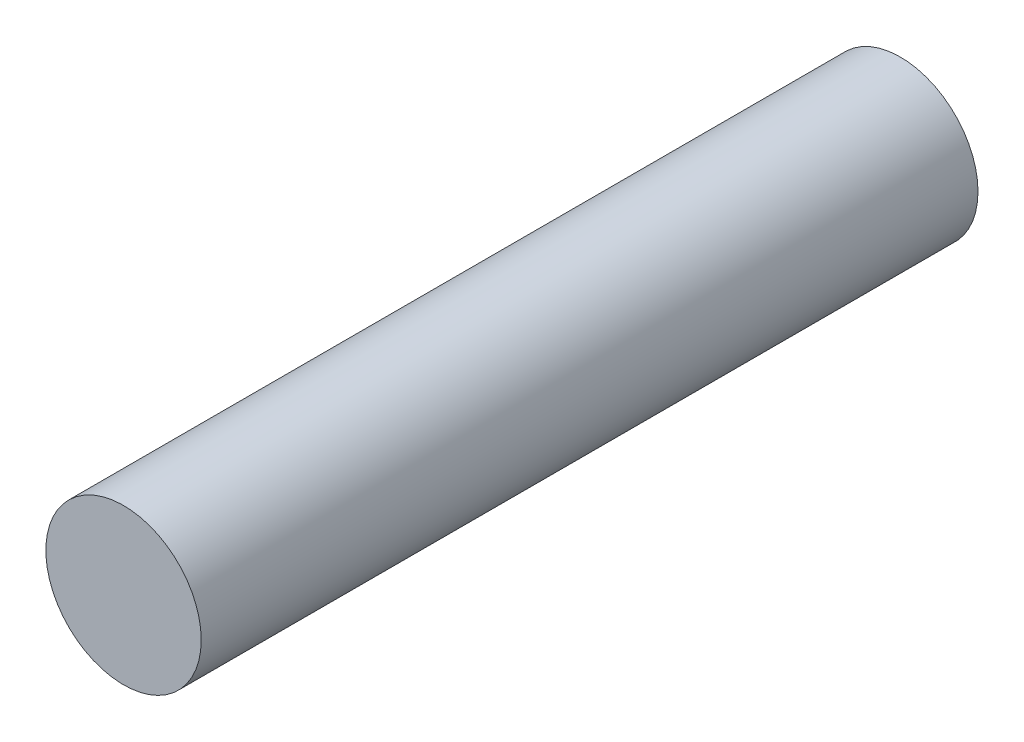
ISO-10303-21;
HEADER;
FILE_DESCRIPTION(('STEP AP214'),'2;1');
FILE_NAME('part.step','',(''),(''),'','','');
FILE_SCHEMA(('AUTOMOTIVE_DESIGN { 1 0 10303 214 1 1 1 1 }'));
ENDSEC;
DATA;
#1=APPLICATION_CONTEXT('core data for automotive mechanical design processes');
#2=APPLICATION_PROTOCOL_DEFINITION('international standard','automotive_design',2000,#1);
#3=PRODUCT_CONTEXT('',#1,'mechanical');
#4=PRODUCT('Part','Part','',(#3));
#5=PRODUCT_RELATED_PRODUCT_CATEGORY('part','',(#4));
#6=PRODUCT_DEFINITION_FORMATION('','',#4);
#7=PRODUCT_DEFINITION_CONTEXT('part definition',#1,'design');
#8=PRODUCT_DEFINITION('design','',#6,#7);
#9=PRODUCT_DEFINITION_SHAPE('','',#8);
#10=(LENGTH_UNIT() NAMED_UNIT(*) SI_UNIT(.MILLI.,.METRE.));
#11=(NAMED_UNIT(*) PLANE_ANGLE_UNIT() SI_UNIT($,.RADIAN.));
#12=(NAMED_UNIT(*) SI_UNIT($,.STERADIAN.) SOLID_ANGLE_UNIT());
#13=UNCERTAINTY_MEASURE_WITH_UNIT(LENGTH_MEASURE(1.E-05),#10,'distance_accuracy_value','');
#14=(GEOMETRIC_REPRESENTATION_CONTEXT(3) GLOBAL_UNCERTAINTY_ASSIGNED_CONTEXT((#13)) GLOBAL_UNIT_ASSIGNED_CONTEXT((#10,
#11,#12)) REPRESENTATION_CONTEXT('',''));
#15=CARTESIAN_POINT('',(0.,0.,0.));
#16=DIRECTION('',(0.,0.,1.));
#17=DIRECTION('',(1.,0.,0.));
#18=AXIS2_PLACEMENT_3D('',#15,#16,#17);
#19=CARTESIAN_POINT('',(11.2033773374803,3.29906958597206,10.));
#20=DIRECTION('',(0.,0.,-1.));
#21=DIRECTION('',(-1.,0.,0.));
#22=AXIS2_PLACEMENT_3D('',#19,#20,#21);
#23=CYLINDRICAL_SURFACE('',#22,1.);
#24=CARTESIAN_POINT('',(11.2033773374803,3.29906958597206,10.));
#25=DIRECTION('',(0.,0.,1.));
#26=DIRECTION('',(1.,0.,0.));
#27=AXIS2_PLACEMENT_3D('',#24,#25,#26);
#28=CIRCLE('',#27,1.);
#29=CARTESIAN_POINT('',(12.2033773374803,3.29906958597206,10.));
#30=VERTEX_POINT('',#29);
#31=EDGE_CURVE('E10',#30,#30,#28,.T.);
#32=ORIENTED_EDGE('',*,*,#31,.F.);
#33=EDGE_LOOP('',(#32));
#34=FACE_BOUND('',#33,.T.);
#35=CARTESIAN_POINT('',(11.2033773374803,3.29906958597206,0.));
#36=DIRECTION('',(0.,0.,1.));
#37=DIRECTION('',(1.,0.,0.));
#38=AXIS2_PLACEMENT_3D('',#35,#36,#37);
#39=CIRCLE('',#38,1.);
#40=CARTESIAN_POINT('',(12.2033773374803,3.29906958597206,0.));
#41=VERTEX_POINT('',#40);
#42=EDGE_CURVE('E40',#41,#41,#39,.T.);
#43=ORIENTED_EDGE('',*,*,#42,.T.);
#44=EDGE_LOOP('',(#43));
#45=FACE_BOUND('',#44,.T.);
#46=ADVANCED_FACE('F37',(#34,#45),#23,.T.);
#47=CARTESIAN_POINT('',(11.2033773374803,3.29906958597206,10.));
#48=DIRECTION('',(0.,0.,1.));
#49=DIRECTION('',(1.,0.,0.));
#50=AXIS2_PLACEMENT_3D('',#47,#48,#49);
#51=PLANE('',#50);
#52=ORIENTED_EDGE('',*,*,#31,.T.);
#53=EDGE_LOOP('',(#52));
#54=FACE_BOUND('',#53,.T.);
#55=ADVANCED_FACE('F52',(#54),#51,.T.);
#56=CARTESIAN_POINT('',(11.2033773374803,3.29906958597206,0.));
#57=DIRECTION('',(0.,0.,1.));
#58=DIRECTION('',(1.,0.,0.));
#59=AXIS2_PLACEMENT_3D('',#56,#57,#58);
#60=PLANE('',#59);
#61=ORIENTED_EDGE('',*,*,#42,.F.);
#62=EDGE_LOOP('',(#61));
#63=FACE_BOUND('',#62,.T.);
#64=ADVANCED_FACE('F50',(#63),#60,.F.);
#65=CLOSED_SHELL('',(#46,#55,#64));
#66=MANIFOLD_SOLID_BREP('B2',#65);
#67=ADVANCED_BREP_SHAPE_REPRESENTATION('',(#18,#66),#14);
#68=SHAPE_DEFINITION_REPRESENTATION(#9,#67);
ENDSEC;
END-ISO-10303-21;
